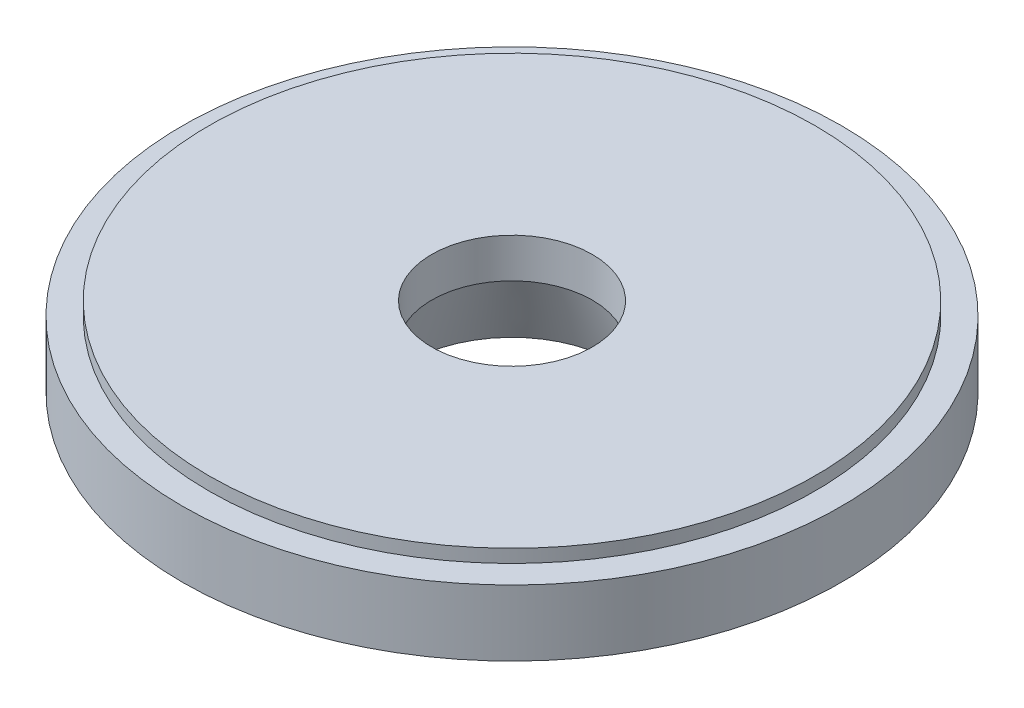
ISO-10303-21;
HEADER;
FILE_DESCRIPTION(('STEP AP214'),'2;1');
FILE_NAME('part.step','',(''),(''),'','','');
FILE_SCHEMA(('AUTOMOTIVE_DESIGN { 1 0 10303 214 1 1 1 1 }'));
ENDSEC;
DATA;
#1=APPLICATION_CONTEXT('core data for automotive mechanical design processes');
#2=APPLICATION_PROTOCOL_DEFINITION('international standard','automotive_design',2000,#1);
#3=PRODUCT_CONTEXT('',#1,'mechanical');
#4=PRODUCT('Part','Part','',(#3));
#5=PRODUCT_RELATED_PRODUCT_CATEGORY('part','',(#4));
#6=PRODUCT_DEFINITION_FORMATION('','',#4);
#7=PRODUCT_DEFINITION_CONTEXT('part definition',#1,'design');
#8=PRODUCT_DEFINITION('design','',#6,#7);
#9=PRODUCT_DEFINITION_SHAPE('','',#8);
#10=(LENGTH_UNIT() NAMED_UNIT(*) SI_UNIT(.MILLI.,.METRE.));
#11=(NAMED_UNIT(*) PLANE_ANGLE_UNIT() SI_UNIT($,.RADIAN.));
#12=(NAMED_UNIT(*) SI_UNIT($,.STERADIAN.) SOLID_ANGLE_UNIT());
#13=UNCERTAINTY_MEASURE_WITH_UNIT(LENGTH_MEASURE(1.E-05),#10,'distance_accuracy_value','');
#14=(GEOMETRIC_REPRESENTATION_CONTEXT(3) GLOBAL_UNCERTAINTY_ASSIGNED_CONTEXT((#13)) GLOBAL_UNIT_ASSIGNED_CONTEXT((#10,
#11,#12)) REPRESENTATION_CONTEXT('',''));
#15=CARTESIAN_POINT('',(0.,0.,0.));
#16=DIRECTION('',(0.,0.,1.));
#17=DIRECTION('',(1.,0.,0.));
#18=AXIS2_PLACEMENT_3D('',#15,#16,#17);
#19=CARTESIAN_POINT('',(0.,1.5,0.));
#20=DIRECTION('',(0.,1.,0.));
#21=DIRECTION('',(0.,0.,1.));
#22=AXIS2_PLACEMENT_3D('',#19,#20,#21);
#23=PLANE('',#22);
#24=CARTESIAN_POINT('',(0.,1.5,0.));
#25=DIRECTION('',(0.,1.,0.));
#26=DIRECTION('',(0.,0.,1.));
#27=AXIS2_PLACEMENT_3D('',#24,#25,#26);
#28=CIRCLE('',#27,11.5);
#29=CARTESIAN_POINT('',(0.,1.5,11.5));
#30=VERTEX_POINT('',#29);
#31=EDGE_CURVE('E68',#30,#30,#28,.T.);
#32=ORIENTED_EDGE('',*,*,#31,.F.);
#33=EDGE_LOOP('',(#32));
#34=FACE_BOUND('',#33,.T.);
#35=CARTESIAN_POINT('',(0.,1.5,0.));
#36=DIRECTION('',(0.,1.,0.));
#37=DIRECTION('',(0.,0.,1.));
#38=AXIS2_PLACEMENT_3D('',#35,#36,#37);
#39=CIRCLE('',#38,3.5459553513993);
#40=CARTESIAN_POINT('',(0.,1.5,3.5459553513993));
#41=VERTEX_POINT('',#40);
#42=EDGE_CURVE('E10',#41,#41,#39,.F.);
#43=ORIENTED_EDGE('',*,*,#42,.F.);
#44=EDGE_LOOP('',(#43));
#45=FACE_BOUND('',#44,.T.);
#46=ADVANCED_FACE('F40',(#34,#45),#23,.F.);
#47=CARTESIAN_POINT('',(0.,2.5,0.));
#48=DIRECTION('',(0.,-1.,0.));
#49=DIRECTION('',(0.,0.,-1.));
#50=AXIS2_PLACEMENT_3D('',#47,#48,#49);
#51=CYLINDRICAL_SURFACE('',#50,12.5);
#52=CARTESIAN_POINT('',(0.,2.5,0.));
#53=DIRECTION('',(0.,1.,0.));
#54=DIRECTION('',(0.,0.,1.));
#55=AXIS2_PLACEMENT_3D('',#52,#53,#54);
#56=CIRCLE('',#55,12.5);
#57=CARTESIAN_POINT('',(0.,2.5,12.5));
#58=VERTEX_POINT('',#57);
#59=EDGE_CURVE('E57',#58,#58,#56,.T.);
#60=ORIENTED_EDGE('',*,*,#59,.F.);
#61=EDGE_LOOP('',(#60));
#62=FACE_BOUND('',#61,.T.);
#63=CARTESIAN_POINT('',(0.,0.,0.));
#64=DIRECTION('',(0.,1.,0.));
#65=DIRECTION('',(0.,0.,1.));
#66=AXIS2_PLACEMENT_3D('',#63,#64,#65);
#67=CIRCLE('',#66,12.5);
#68=CARTESIAN_POINT('',(0.,0.,12.5));
#69=VERTEX_POINT('',#68);
#70=EDGE_CURVE('E72',#69,#69,#67,.T.);
#71=ORIENTED_EDGE('',*,*,#70,.T.);
#72=EDGE_LOOP('',(#71));
#73=FACE_BOUND('',#72,.T.);
#74=ADVANCED_FACE('F42',(#62,#73),#51,.T.);
#75=CARTESIAN_POINT('',(0.,2.5,0.));
#76=DIRECTION('',(0.,1.,0.));
#77=DIRECTION('',(0.,0.,1.));
#78=AXIS2_PLACEMENT_3D('',#75,#76,#77);
#79=PLANE('',#78);
#80=CARTESIAN_POINT('',(0.,2.5,0.));
#81=DIRECTION('',(0.,1.,0.));
#82=DIRECTION('',(0.,0.,1.));
#83=AXIS2_PLACEMENT_3D('',#80,#81,#82);
#84=CIRCLE('',#83,11.5);
#85=CARTESIAN_POINT('',(0.,2.5,11.5));
#86=VERTEX_POINT('',#85);
#87=EDGE_CURVE('E49',#86,#86,#84,.T.);
#88=ORIENTED_EDGE('',*,*,#87,.F.);
#89=EDGE_LOOP('',(#88));
#90=FACE_BOUND('',#89,.T.);
#91=ORIENTED_EDGE('',*,*,#59,.T.);
#92=EDGE_LOOP('',(#91));
#93=FACE_BOUND('',#92,.T.);
#94=ADVANCED_FACE('F86',(#90,#93),#79,.T.);
#95=CARTESIAN_POINT('',(0.,0.,0.));
#96=DIRECTION('',(0.,1.,0.));
#97=DIRECTION('',(0.,0.,1.));
#98=AXIS2_PLACEMENT_3D('',#95,#96,#97);
#99=PLANE('',#98);
#100=CARTESIAN_POINT('',(0.,0.,0.));
#101=DIRECTION('',(0.,1.,0.));
#102=DIRECTION('',(0.,0.,1.));
#103=AXIS2_PLACEMENT_3D('',#100,#101,#102);
#104=CIRCLE('',#103,11.5);
#105=CARTESIAN_POINT('',(0.,0.,11.5));
#106=VERTEX_POINT('',#105);
#107=EDGE_CURVE('E66',#106,#106,#104,.T.);
#108=ORIENTED_EDGE('',*,*,#107,.T.);
#109=EDGE_LOOP('',(#108));
#110=FACE_BOUND('',#109,.T.);
#111=ORIENTED_EDGE('',*,*,#70,.F.);
#112=EDGE_LOOP('',(#111));
#113=FACE_BOUND('',#112,.T.);
#114=ADVANCED_FACE('F83',(#110,#113),#99,.F.);
#115=CARTESIAN_POINT('',(0.,2.5,0.));
#116=DIRECTION('',(0.,-1.,0.));
#117=DIRECTION('',(0.,0.,-1.));
#118=AXIS2_PLACEMENT_3D('',#115,#116,#117);
#119=CYLINDRICAL_SURFACE('',#118,11.5);
#120=ORIENTED_EDGE('',*,*,#31,.T.);
#121=EDGE_LOOP('',(#120));
#122=FACE_BOUND('',#121,.T.);
#123=ORIENTED_EDGE('',*,*,#107,.F.);
#124=EDGE_LOOP('',(#123));
#125=FACE_BOUND('',#124,.T.);
#126=ADVANCED_FACE('F85',(#122,#125),#119,.F.);
#127=CARTESIAN_POINT('',(0.,3.,0.));
#128=DIRECTION('',(0.,-1.,0.));
#129=DIRECTION('',(0.,0.,-1.));
#130=AXIS2_PLACEMENT_3D('',#127,#128,#129);
#131=CYLINDRICAL_SURFACE('',#130,11.5);
#132=CARTESIAN_POINT('',(0.,3.,0.));
#133=DIRECTION('',(0.,1.,0.));
#134=DIRECTION('',(0.,0.,1.));
#135=AXIS2_PLACEMENT_3D('',#132,#133,#134);
#136=CIRCLE('',#135,11.5);
#137=CARTESIAN_POINT('',(0.,3.,11.5));
#138=VERTEX_POINT('',#137);
#139=EDGE_CURVE('E63',#138,#138,#136,.T.);
#140=ORIENTED_EDGE('',*,*,#139,.F.);
#141=EDGE_LOOP('',(#140));
#142=FACE_BOUND('',#141,.T.);
#143=ORIENTED_EDGE('',*,*,#87,.T.);
#144=EDGE_LOOP('',(#143));
#145=FACE_BOUND('',#144,.T.);
#146=ADVANCED_FACE('F92',(#142,#145),#131,.T.);
#147=CARTESIAN_POINT('',(0.,3.,0.));
#148=DIRECTION('',(0.,1.,0.));
#149=DIRECTION('',(0.,0.,1.));
#150=AXIS2_PLACEMENT_3D('',#147,#148,#149);
#151=PLANE('',#150);
#152=CARTESIAN_POINT('',(0.,3.,0.));
#153=DIRECTION('',(0.,1.,0.));
#154=DIRECTION('',(0.,0.,1.));
#155=AXIS2_PLACEMENT_3D('',#152,#153,#154);
#156=CIRCLE('',#155,3.0459553513993);
#157=CARTESIAN_POINT('',(0.,3.,-3.0459553513993));
#158=VERTEX_POINT('',#157);
#159=EDGE_CURVE('E44',#158,#158,#156,.T.);
#160=ORIENTED_EDGE('',*,*,#159,.F.);
#161=EDGE_LOOP('',(#160));
#162=FACE_BOUND('',#161,.T.);
#163=ORIENTED_EDGE('',*,*,#139,.T.);
#164=EDGE_LOOP('',(#163));
#165=FACE_BOUND('',#164,.T.);
#166=ADVANCED_FACE('F109',(#162,#165),#151,.T.);
#167=CARTESIAN_POINT('',(0.,-0.999999999999998,0.));
#168=DIRECTION('',(0.,-1.,0.));
#169=DIRECTION('',(0.,0.,-1.));
#170=AXIS2_PLACEMENT_3D('',#167,#168,#169);
#171=CONICAL_SURFACE('',#170,4.4558809370648,0.349065850398864);
#172=CARTESIAN_POINT('',(0.,-0.999999999999998,0.));
#173=DIRECTION('',(0.,1.,0.));
#174=DIRECTION('',(0.,0.,1.));
#175=AXIS2_PLACEMENT_3D('',#172,#173,#174);
#176=CIRCLE('',#175,4.4558809370648);
#177=CARTESIAN_POINT('',(0.,-0.999999999999998,4.4558809370648));
#178=VERTEX_POINT('',#177);
#179=EDGE_CURVE('E140',#178,#178,#176,.T.);
#180=ORIENTED_EDGE('',*,*,#179,.T.);
#181=EDGE_LOOP('',(#180));
#182=FACE_BOUND('',#181,.T.);
#183=ORIENTED_EDGE('',*,*,#42,.T.);
#184=EDGE_LOOP('',(#183));
#185=FACE_BOUND('',#184,.T.);
#186=ADVANCED_FACE('F113',(#182,#185),#171,.T.);
#187=CARTESIAN_POINT('',(0.,3.,0.));
#188=DIRECTION('',(0.,-1.,0.));
#189=DIRECTION('',(0.,0.,-1.));
#190=AXIS2_PLACEMENT_3D('',#187,#188,#189);
#191=CONICAL_SURFACE('',#190,2.5,0.349065850398863);
#192=CARTESIAN_POINT('',(0.,-0.999999999999998,0.));
#193=DIRECTION('',(0.,1.,0.));
#194=DIRECTION('',(0.,0.,1.));
#195=AXIS2_PLACEMENT_3D('',#192,#193,#194);
#196=CIRCLE('',#195,3.9558809370648);
#197=CARTESIAN_POINT('',(0.,-0.999999999999998,3.9558809370648));
#198=VERTEX_POINT('',#197);
#199=EDGE_CURVE('E61',#198,#198,#196,.T.);
#200=ORIENTED_EDGE('',*,*,#199,.F.);
#201=EDGE_LOOP('',(#200));
#202=FACE_BOUND('',#201,.T.);
#203=CARTESIAN_POINT('',(0.,1.5,0.));
#204=DIRECTION('',(0.,-1.,0.));
#205=DIRECTION('',(0.,0.,-1.));
#206=AXIS2_PLACEMENT_3D('',#203,#204,#205);
#207=CIRCLE('',#206,3.0459553513993);
#208=CARTESIAN_POINT('',(0.,1.5,-3.0459553513993));
#209=VERTEX_POINT('',#208);
#210=EDGE_CURVE('E136',#209,#209,#207,.T.);
#211=ORIENTED_EDGE('',*,*,#210,.F.);
#212=EDGE_LOOP('',(#211));
#213=FACE_BOUND('',#212,.T.);
#214=ADVANCED_FACE('F117',(#202,#213),#191,.F.);
#215=CARTESIAN_POINT('',(4.4558809370648,-0.999999999999998,0.));
#216=DIRECTION('',(0.,1.,0.));
#217=DIRECTION('',(0.,0.,1.));
#218=AXIS2_PLACEMENT_3D('',#215,#216,#217);
#219=PLANE('',#218);
#220=ORIENTED_EDGE('',*,*,#179,.F.);
#221=EDGE_LOOP('',(#220));
#222=FACE_BOUND('',#221,.T.);
#223=ORIENTED_EDGE('',*,*,#199,.T.);
#224=EDGE_LOOP('',(#223));
#225=FACE_BOUND('',#224,.T.);
#226=ADVANCED_FACE('F121',(#222,#225),#219,.F.);
#227=CARTESIAN_POINT('',(0.,12.,0.));
#228=DIRECTION('',(0.,-1.,0.));
#229=DIRECTION('',(0.,0.,-1.));
#230=AXIS2_PLACEMENT_3D('',#227,#228,#229);
#231=CYLINDRICAL_SURFACE('',#230,3.0459553513993);
#232=CARTESIAN_POINT('',(0.,3.,-3.0459553513993));
#233=CARTESIAN_POINT('',(0.,2.984375,-3.0459553513993));
#234=CARTESIAN_POINT('',(0.,2.96875,-3.0459553513993));
#235=CARTESIAN_POINT('',(0.,2.9375,-3.0459553513993));
#236=CARTESIAN_POINT('',(0.,2.921875,-3.0459553513993));
#237=CARTESIAN_POINT('',(0.,2.890625,-3.0459553513993));
#238=CARTESIAN_POINT('',(0.,2.875,-3.0459553513993));
#239=CARTESIAN_POINT('',(0.,2.84375,-3.0459553513993));
#240=CARTESIAN_POINT('',(0.,2.828125,-3.0459553513993));
#241=CARTESIAN_POINT('',(0.,2.796875,-3.0459553513993));
#242=CARTESIAN_POINT('',(0.,2.78125,-3.0459553513993));
#243=CARTESIAN_POINT('',(0.,2.75,-3.0459553513993));
#244=CARTESIAN_POINT('',(0.,2.734375,-3.0459553513993));
#245=CARTESIAN_POINT('',(0.,2.703125,-3.0459553513993));
#246=CARTESIAN_POINT('',(0.,2.6875,-3.0459553513993));
#247=CARTESIAN_POINT('',(0.,2.65625,-3.0459553513993));
#248=CARTESIAN_POINT('',(0.,2.640625,-3.0459553513993));
#249=CARTESIAN_POINT('',(0.,2.609375,-3.0459553513993));
#250=CARTESIAN_POINT('',(0.,2.59375,-3.0459553513993));
#251=CARTESIAN_POINT('',(0.,2.5625,-3.0459553513993));
#252=CARTESIAN_POINT('',(0.,2.546875,-3.0459553513993));
#253=CARTESIAN_POINT('',(0.,2.515625,-3.0459553513993));
#254=CARTESIAN_POINT('',(0.,2.5,-3.0459553513993));
#255=CARTESIAN_POINT('',(0.,2.46875,-3.0459553513993));
#256=CARTESIAN_POINT('',(0.,2.453125,-3.0459553513993));
#257=CARTESIAN_POINT('',(0.,2.421875,-3.0459553513993));
#258=CARTESIAN_POINT('',(0.,2.40625,-3.0459553513993));
#259=CARTESIAN_POINT('',(0.,2.375,-3.0459553513993));
#260=CARTESIAN_POINT('',(0.,2.359375,-3.0459553513993));
#261=CARTESIAN_POINT('',(0.,2.328125,-3.0459553513993));
#262=CARTESIAN_POINT('',(0.,2.3125,-3.0459553513993));
#263=CARTESIAN_POINT('',(0.,2.28125,-3.0459553513993));
#264=CARTESIAN_POINT('',(0.,2.265625,-3.0459553513993));
#265=CARTESIAN_POINT('',(0.,2.234375,-3.0459553513993));
#266=CARTESIAN_POINT('',(0.,2.21875,-3.0459553513993));
#267=CARTESIAN_POINT('',(0.,2.1875,-3.0459553513993));
#268=CARTESIAN_POINT('',(0.,2.171875,-3.0459553513993));
#269=CARTESIAN_POINT('',(0.,2.140625,-3.0459553513993));
#270=CARTESIAN_POINT('',(0.,2.125,-3.0459553513993));
#271=CARTESIAN_POINT('',(0.,2.09375,-3.0459553513993));
#272=CARTESIAN_POINT('',(0.,2.078125,-3.0459553513993));
#273=CARTESIAN_POINT('',(0.,2.046875,-3.0459553513993));
#274=CARTESIAN_POINT('',(0.,2.03125,-3.0459553513993));
#275=CARTESIAN_POINT('',(0.,2.,-3.0459553513993));
#276=CARTESIAN_POINT('',(0.,1.984375,-3.0459553513993));
#277=CARTESIAN_POINT('',(0.,1.953125,-3.0459553513993));
#278=CARTESIAN_POINT('',(0.,1.9375,-3.0459553513993));
#279=CARTESIAN_POINT('',(0.,1.90625,-3.0459553513993));
#280=CARTESIAN_POINT('',(0.,1.890625,-3.0459553513993));
#281=CARTESIAN_POINT('',(0.,1.859375,-3.0459553513993));
#282=CARTESIAN_POINT('',(0.,1.84375,-3.0459553513993));
#283=CARTESIAN_POINT('',(0.,1.8125,-3.0459553513993));
#284=CARTESIAN_POINT('',(0.,1.796875,-3.0459553513993));
#285=CARTESIAN_POINT('',(0.,1.765625,-3.0459553513993));
#286=CARTESIAN_POINT('',(0.,1.75,-3.0459553513993));
#287=CARTESIAN_POINT('',(0.,1.71875,-3.0459553513993));
#288=CARTESIAN_POINT('',(0.,1.703125,-3.0459553513993));
#289=CARTESIAN_POINT('',(0.,1.671875,-3.0459553513993));
#290=CARTESIAN_POINT('',(0.,1.65625,-3.0459553513993));
#291=CARTESIAN_POINT('',(0.,1.625,-3.0459553513993));
#292=CARTESIAN_POINT('',(0.,1.609375,-3.0459553513993));
#293=CARTESIAN_POINT('',(0.,1.578125,-3.0459553513993));
#294=CARTESIAN_POINT('',(0.,1.5625,-3.0459553513993));
#295=CARTESIAN_POINT('',(0.,1.53125,-3.0459553513993));
#296=CARTESIAN_POINT('',(0.,1.515625,-3.0459553513993));
#297=CARTESIAN_POINT('',(0.,1.5,-3.0459553513993));
#298=B_SPLINE_CURVE_WITH_KNOTS('',3,(#232,#233,#234,#235,#236,#237,#238,#239,#240,#241,#242,
#243,#244,#245,#246,#247,#248,#249,#250,#251,#252,#253,#254,#255,#256,#257,#258,#259,#260,#261,
#262,#263,#264,#265,#266,#267,#268,#269,#270,#271,#272,#273,#274,#275,#276,#277,#278,#279,#280,
#281,#282,#283,#284,#285,#286,#287,#288,#289,#290,#291,#292,#293,#294,#295,#296,#297),
.UNSPECIFIED.,.F.,.F.,(4,2,2,2,2,2,2,2,2,2,2,2,2,2,2,2,2,2,2,2,2,2,2,2,2,2,2,2,2,2,2,2,4),(0.,
0.046875,0.0937500000000001,0.140625,0.1875,0.234375,0.28125,0.328125,0.375,0.421874999999999,
0.468749999999999,0.515624999999999,0.562499999999999,0.609374999999999,0.656249999999999,
0.703124999999999,0.749999999999999,0.796874999999999,0.843749999999999,0.890624999999999,
0.937499999999999,0.984374999999999,1.03125,1.078125,1.125,1.171875,1.21875,1.265625,1.3125,
1.359375,1.40625,1.453125,1.5),.UNSPECIFIED.);
#299=EDGE_CURVE('BSEAM125',#158,#209,#298,.T.);
#300=ORIENTED_EDGE('',*,*,#159,.T.);
#301=ORIENTED_EDGE('',*,*,#210,.T.);
#302=ORIENTED_EDGE('',*,*,#299,.T.);
#303=ORIENTED_EDGE('',*,*,#299,.F.);
#304=EDGE_LOOP('',(#300,#302,#301,#303));
#305=FACE_BOUND('',#304,.T.);
#306=ADVANCED_FACE('F125',(#305),#231,.F.);
#307=CLOSED_SHELL('',(#46,#74,#94,#114,#126,#146,#166,#186,#214,#226,#306));
#308=MANIFOLD_SOLID_BREP('B2',#307);
#309=ADVANCED_BREP_SHAPE_REPRESENTATION('',(#18,#308),#14);
#310=SHAPE_DEFINITION_REPRESENTATION(#9,#309);
ENDSEC;
END-ISO-10303-21;
